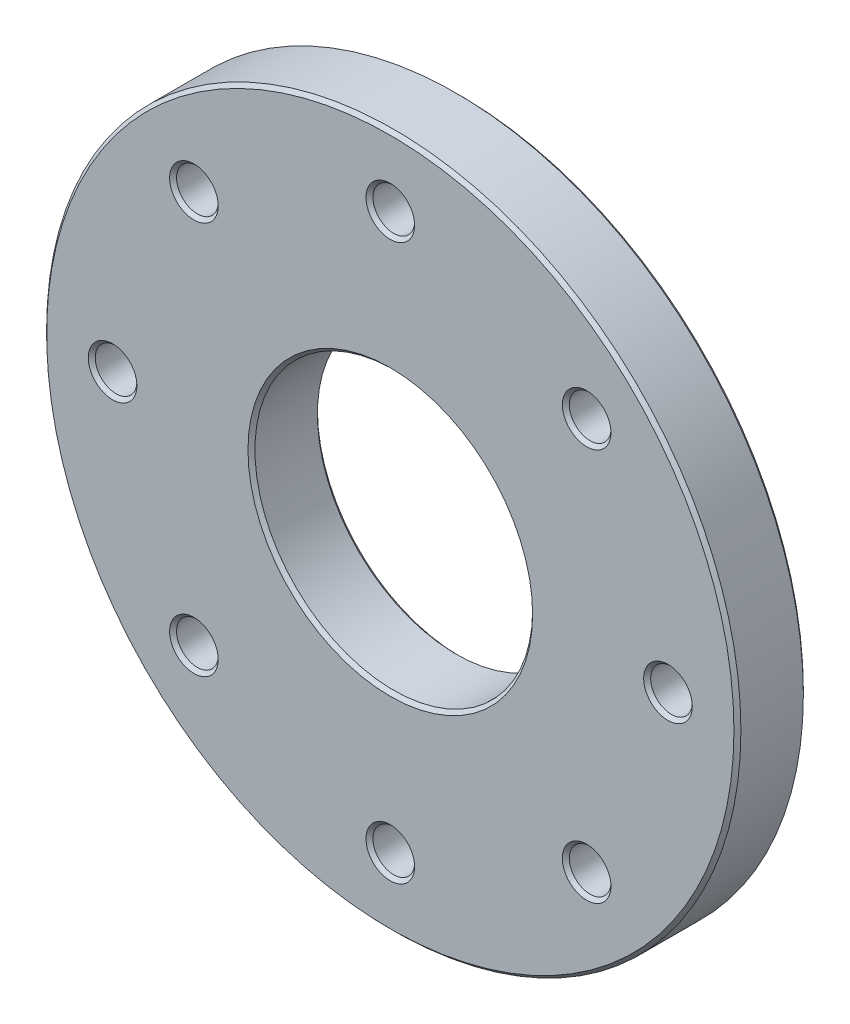
ISO-10303-21;
HEADER;
FILE_DESCRIPTION(('STEP AP214'),'2;1');
FILE_NAME('part.step','',(''),(''),'','','');
FILE_SCHEMA(('AUTOMOTIVE_DESIGN { 1 0 10303 214 1 1 1 1 }'));
ENDSEC;
DATA;
#1=APPLICATION_CONTEXT('core data for automotive mechanical design processes');
#2=APPLICATION_PROTOCOL_DEFINITION('international standard','automotive_design',2000,#1);
#3=PRODUCT_CONTEXT('',#1,'mechanical');
#4=PRODUCT('Part','Part','',(#3));
#5=PRODUCT_RELATED_PRODUCT_CATEGORY('part','',(#4));
#6=PRODUCT_DEFINITION_FORMATION('','',#4);
#7=PRODUCT_DEFINITION_CONTEXT('part definition',#1,'design');
#8=PRODUCT_DEFINITION('design','',#6,#7);
#9=PRODUCT_DEFINITION_SHAPE('','',#8);
#10=(LENGTH_UNIT() NAMED_UNIT(*) SI_UNIT(.MILLI.,.METRE.));
#11=(NAMED_UNIT(*) PLANE_ANGLE_UNIT() SI_UNIT($,.RADIAN.));
#12=(NAMED_UNIT(*) SI_UNIT($,.STERADIAN.) SOLID_ANGLE_UNIT());
#13=UNCERTAINTY_MEASURE_WITH_UNIT(LENGTH_MEASURE(1.E-05),#10,'distance_accuracy_value','');
#14=(GEOMETRIC_REPRESENTATION_CONTEXT(3) GLOBAL_UNCERTAINTY_ASSIGNED_CONTEXT((#13)) GLOBAL_UNIT_ASSIGNED_CONTEXT((#10,
#11,#12)) REPRESENTATION_CONTEXT('',''));
#15=CARTESIAN_POINT('',(0.,0.,0.));
#16=DIRECTION('',(0.,0.,1.));
#17=DIRECTION('',(1.,0.,0.));
#18=AXIS2_PLACEMENT_3D('',#15,#16,#17);
#19=CARTESIAN_POINT('',(-56.56854249492,56.568542494924,0.));
#20=DIRECTION('',(0.,0.,-1.));
#21=DIRECTION('',(1.,0.,0.));
#22=AXIS2_PLACEMENT_3D('',#19,#20,#21);
#23=CYLINDRICAL_SURFACE('',#22,6.);
#24=DIRECTION('',(0.,0.,1.));
#25=VECTOR('',#24,1.);
#26=CARTESIAN_POINT('',(-50.56854249492,56.568542494924,0.));
#27=LINE('',#26,#25);
#28=CARTESIAN_POINT('',(-50.56854249492,56.568542494924,1.));
#29=VERTEX_POINT('',#28);
#30=CARTESIAN_POINT('',(-50.56854249492,56.568542494924,19.));
#31=VERTEX_POINT('',#30);
#32=EDGE_CURVE('E10',#29,#31,#27,.T.);
#33=ORIENTED_EDGE('',*,*,#32,.F.);
#34=CARTESIAN_POINT('',(-56.56854249492,56.568542494924,1.));
#35=DIRECTION('',(0.,0.,1.));
#36=DIRECTION('',(1.,0.,0.));
#37=AXIS2_PLACEMENT_3D('',#34,#35,#36);
#38=CIRCLE('',#37,6.);
#39=EDGE_CURVE('E399',#29,#29,#38,.T.);
#40=ORIENTED_EDGE('',*,*,#39,.F.);
#41=ORIENTED_EDGE('',*,*,#32,.T.);
#42=CARTESIAN_POINT('',(-56.56854249492,56.568542494924,19.));
#43=DIRECTION('',(0.,0.,-1.));
#44=DIRECTION('',(1.,0.,0.));
#45=AXIS2_PLACEMENT_3D('',#42,#43,#44);
#46=CIRCLE('',#45,6.);
#47=EDGE_CURVE('E428',#31,#31,#46,.T.);
#48=ORIENTED_EDGE('',*,*,#47,.F.);
#49=EDGE_LOOP('',(#33,#40,#41,#48));
#50=FACE_BOUND('',#49,.T.);
#51=ADVANCED_FACE('F16',(#50),#23,.F.);
#52=CARTESIAN_POINT('',(0.,80.,0.));
#53=DIRECTION('',(0.,0.,-1.));
#54=DIRECTION('',(1.,0.,0.));
#55=AXIS2_PLACEMENT_3D('',#52,#53,#54);
#56=CYLINDRICAL_SURFACE('',#55,6.);
#57=DIRECTION('',(0.,0.,1.));
#58=VECTOR('',#57,1.);
#59=CARTESIAN_POINT('',(6.,80.,0.));
#60=LINE('',#59,#58);
#61=CARTESIAN_POINT('',(6.,80.,1.));
#62=VERTEX_POINT('',#61);
#63=CARTESIAN_POINT('',(6.,80.,19.));
#64=VERTEX_POINT('',#63);
#65=EDGE_CURVE('E24',#62,#64,#60,.T.);
#66=ORIENTED_EDGE('',*,*,#65,.F.);
#67=CARTESIAN_POINT('',(0.,80.,1.));
#68=DIRECTION('',(0.,0.,1.));
#69=DIRECTION('',(1.,0.,0.));
#70=AXIS2_PLACEMENT_3D('',#67,#68,#69);
#71=CIRCLE('',#70,6.);
#72=EDGE_CURVE('E385',#62,#62,#71,.T.);
#73=ORIENTED_EDGE('',*,*,#72,.F.);
#74=ORIENTED_EDGE('',*,*,#65,.T.);
#75=CARTESIAN_POINT('',(0.,80.,19.));
#76=DIRECTION('',(0.,0.,-1.));
#77=DIRECTION('',(1.,0.,0.));
#78=AXIS2_PLACEMENT_3D('',#75,#76,#77);
#79=CIRCLE('',#78,6.);
#80=EDGE_CURVE('E452',#64,#64,#79,.T.);
#81=ORIENTED_EDGE('',*,*,#80,.F.);
#82=EDGE_LOOP('',(#66,#73,#74,#81));
#83=FACE_BOUND('',#82,.T.);
#84=ADVANCED_FACE('F503',(#83),#56,.F.);
#85=CARTESIAN_POINT('',(-80.,0.,0.));
#86=DIRECTION('',(0.,0.,-1.));
#87=DIRECTION('',(1.,0.,0.));
#88=AXIS2_PLACEMENT_3D('',#85,#86,#87);
#89=CYLINDRICAL_SURFACE('',#88,6.);
#90=DIRECTION('',(0.,0.,1.));
#91=VECTOR('',#90,1.);
#92=CARTESIAN_POINT('',(-74.,0.,0.));
#93=LINE('',#92,#91);
#94=CARTESIAN_POINT('',(-74.,0.,1.));
#95=VERTEX_POINT('',#94);
#96=CARTESIAN_POINT('',(-74.,0.,19.));
#97=VERTEX_POINT('',#96);
#98=EDGE_CURVE('E389',#95,#97,#93,.T.);
#99=ORIENTED_EDGE('',*,*,#98,.F.);
#100=CARTESIAN_POINT('',(-80.,0.,1.));
#101=DIRECTION('',(0.,0.,1.));
#102=DIRECTION('',(1.,0.,0.));
#103=AXIS2_PLACEMENT_3D('',#100,#101,#102);
#104=CIRCLE('',#103,6.);
#105=EDGE_CURVE('E377',#95,#95,#104,.T.);
#106=ORIENTED_EDGE('',*,*,#105,.F.);
#107=ORIENTED_EDGE('',*,*,#98,.T.);
#108=CARTESIAN_POINT('',(-80.,0.,19.));
#109=DIRECTION('',(0.,0.,-1.));
#110=DIRECTION('',(1.,0.,0.));
#111=AXIS2_PLACEMENT_3D('',#108,#109,#110);
#112=CIRCLE('',#111,6.);
#113=EDGE_CURVE('E420',#97,#97,#112,.T.);
#114=ORIENTED_EDGE('',*,*,#113,.F.);
#115=EDGE_LOOP('',(#99,#106,#107,#114));
#116=FACE_BOUND('',#115,.T.);
#117=ADVANCED_FACE('F470',(#116),#89,.F.);
#118=CARTESIAN_POINT('',(0.,0.,0.));
#119=DIRECTION('',(0.,0.,-1.));
#120=DIRECTION('',(1.,0.,0.));
#121=AXIS2_PLACEMENT_3D('',#118,#119,#120);
#122=CYLINDRICAL_SURFACE('',#121,40.);
#123=DIRECTION('',(0.,0.,1.));
#124=VECTOR('',#123,1.);
#125=CARTESIAN_POINT('',(40.,0.,0.));
#126=LINE('',#125,#124);
#127=CARTESIAN_POINT('',(40.,0.,1.));
#128=VERTEX_POINT('',#127);
#129=CARTESIAN_POINT('',(40.,0.,19.));
#130=VERTEX_POINT('',#129);
#131=EDGE_CURVE('E386',#128,#130,#126,.T.);
#132=ORIENTED_EDGE('',*,*,#131,.F.);
#133=CARTESIAN_POINT('',(0.,0.,1.));
#134=DIRECTION('',(0.,0.,1.));
#135=DIRECTION('',(1.,0.,0.));
#136=AXIS2_PLACEMENT_3D('',#133,#134,#135);
#137=CIRCLE('',#136,40.);
#138=EDGE_CURVE('E313',#128,#128,#137,.T.);
#139=ORIENTED_EDGE('',*,*,#138,.F.);
#140=ORIENTED_EDGE('',*,*,#131,.T.);
#141=CARTESIAN_POINT('',(0.,0.,19.));
#142=DIRECTION('',(0.,0.,-1.));
#143=DIRECTION('',(1.,0.,0.));
#144=AXIS2_PLACEMENT_3D('',#141,#142,#143);
#145=CIRCLE('',#144,40.);
#146=EDGE_CURVE('E436',#130,#130,#145,.T.);
#147=ORIENTED_EDGE('',*,*,#146,.F.);
#148=EDGE_LOOP('',(#132,#139,#140,#147));
#149=FACE_BOUND('',#148,.T.);
#150=ADVANCED_FACE('F581',(#149),#122,.F.);
#151=CARTESIAN_POINT('',(56.568542494924,56.568542494924,0.));
#152=DIRECTION('',(0.,0.,-1.));
#153=DIRECTION('',(1.,0.,0.));
#154=AXIS2_PLACEMENT_3D('',#151,#152,#153);
#155=CYLINDRICAL_SURFACE('',#154,6.);
#156=DIRECTION('',(0.,0.,1.));
#157=VECTOR('',#156,1.);
#158=CARTESIAN_POINT('',(62.568542494924,56.568542494924,0.));
#159=LINE('',#158,#157);
#160=CARTESIAN_POINT('',(62.568542494924,56.568542494924,1.));
#161=VERTEX_POINT('',#160);
#162=CARTESIAN_POINT('',(62.568542494924,56.568542494924,19.));
#163=VERTEX_POINT('',#162);
#164=EDGE_CURVE('E36',#161,#163,#159,.T.);
#165=ORIENTED_EDGE('',*,*,#164,.F.);
#166=CARTESIAN_POINT('',(56.568542494924,56.568542494924,1.));
#167=DIRECTION('',(0.,0.,1.));
#168=DIRECTION('',(1.,0.,0.));
#169=AXIS2_PLACEMENT_3D('',#166,#167,#168);
#170=CIRCLE('',#169,6.);
#171=EDGE_CURVE('E240',#161,#161,#170,.T.);
#172=ORIENTED_EDGE('',*,*,#171,.F.);
#173=ORIENTED_EDGE('',*,*,#164,.T.);
#174=CARTESIAN_POINT('',(56.568542494924,56.568542494924,19.));
#175=DIRECTION('',(0.,0.,-1.));
#176=DIRECTION('',(1.,0.,0.));
#177=AXIS2_PLACEMENT_3D('',#174,#175,#176);
#178=CIRCLE('',#177,6.);
#179=EDGE_CURVE('E293',#163,#163,#178,.T.);
#180=ORIENTED_EDGE('',*,*,#179,.F.);
#181=EDGE_LOOP('',(#165,#172,#173,#180));
#182=FACE_BOUND('',#181,.T.);
#183=ADVANCED_FACE('F578',(#182),#155,.F.);
#184=CARTESIAN_POINT('',(80.,0.,0.));
#185=DIRECTION('',(0.,0.,-1.));
#186=DIRECTION('',(1.,0.,0.));
#187=AXIS2_PLACEMENT_3D('',#184,#185,#186);
#188=CYLINDRICAL_SURFACE('',#187,6.);
#189=DIRECTION('',(0.,0.,1.));
#190=VECTOR('',#189,1.);
#191=CARTESIAN_POINT('',(86.,0.,0.));
#192=LINE('',#191,#190);
#193=CARTESIAN_POINT('',(86.,0.,1.));
#194=VERTEX_POINT('',#193);
#195=CARTESIAN_POINT('',(86.,0.,19.));
#196=VERTEX_POINT('',#195);
#197=EDGE_CURVE('E346',#194,#196,#192,.T.);
#198=ORIENTED_EDGE('',*,*,#197,.F.);
#199=CARTESIAN_POINT('',(80.,0.,1.));
#200=DIRECTION('',(0.,0.,1.));
#201=DIRECTION('',(1.,0.,0.));
#202=AXIS2_PLACEMENT_3D('',#199,#200,#201);
#203=CIRCLE('',#202,6.);
#204=EDGE_CURVE('E241',#194,#194,#203,.T.);
#205=ORIENTED_EDGE('',*,*,#204,.F.);
#206=ORIENTED_EDGE('',*,*,#197,.T.);
#207=CARTESIAN_POINT('',(80.,0.,19.));
#208=DIRECTION('',(0.,0.,-1.));
#209=DIRECTION('',(1.,0.,0.));
#210=AXIS2_PLACEMENT_3D('',#207,#208,#209);
#211=CIRCLE('',#210,6.);
#212=EDGE_CURVE('E444',#196,#196,#211,.T.);
#213=ORIENTED_EDGE('',*,*,#212,.F.);
#214=EDGE_LOOP('',(#198,#205,#206,#213));
#215=FACE_BOUND('',#214,.T.);
#216=ADVANCED_FACE('F576',(#215),#188,.F.);
#217=CARTESIAN_POINT('',(-56.56854249492,-56.56854249492,0.));
#218=DIRECTION('',(0.,0.,-1.));
#219=DIRECTION('',(1.,0.,0.));
#220=AXIS2_PLACEMENT_3D('',#217,#218,#219);
#221=CYLINDRICAL_SURFACE('',#220,6.);
#222=DIRECTION('',(0.,0.,1.));
#223=VECTOR('',#222,1.);
#224=CARTESIAN_POINT('',(-50.56854249492,-56.56854249492,0.));
#225=LINE('',#224,#223);
#226=CARTESIAN_POINT('',(-50.56854249492,-56.56854249492,1.));
#227=VERTEX_POINT('',#226);
#228=CARTESIAN_POINT('',(-50.56854249492,-56.56854249492,19.));
#229=VERTEX_POINT('',#228);
#230=EDGE_CURVE('E308',#227,#229,#225,.T.);
#231=ORIENTED_EDGE('',*,*,#230,.F.);
#232=CARTESIAN_POINT('',(-56.56854249492,-56.56854249492,1.));
#233=DIRECTION('',(0.,0.,1.));
#234=DIRECTION('',(1.,0.,0.));
#235=AXIS2_PLACEMENT_3D('',#232,#233,#234);
#236=CIRCLE('',#235,6.);
#237=EDGE_CURVE('E356',#227,#227,#236,.T.);
#238=ORIENTED_EDGE('',*,*,#237,.F.);
#239=ORIENTED_EDGE('',*,*,#230,.T.);
#240=CARTESIAN_POINT('',(-56.56854249492,-56.56854249492,19.));
#241=DIRECTION('',(0.,0.,-1.));
#242=DIRECTION('',(1.,0.,0.));
#243=AXIS2_PLACEMENT_3D('',#240,#241,#242);
#244=CIRCLE('',#243,6.);
#245=EDGE_CURVE('E229',#229,#229,#244,.T.);
#246=ORIENTED_EDGE('',*,*,#245,.F.);
#247=EDGE_LOOP('',(#231,#238,#239,#246));
#248=FACE_BOUND('',#247,.T.);
#249=ADVANCED_FACE('F572',(#248),#221,.F.);
#250=CARTESIAN_POINT('',(0.,-80.,0.));
#251=DIRECTION('',(0.,0.,-1.));
#252=DIRECTION('',(1.,0.,0.));
#253=AXIS2_PLACEMENT_3D('',#250,#251,#252);
#254=CYLINDRICAL_SURFACE('',#253,6.);
#255=DIRECTION('',(0.,0.,1.));
#256=VECTOR('',#255,1.);
#257=CARTESIAN_POINT('',(6.,-80.,0.));
#258=LINE('',#257,#256);
#259=CARTESIAN_POINT('',(6.,-80.,1.));
#260=VERTEX_POINT('',#259);
#261=CARTESIAN_POINT('',(6.,-80.,19.));
#262=VERTEX_POINT('',#261);
#263=EDGE_CURVE('E263',#260,#262,#258,.T.);
#264=ORIENTED_EDGE('',*,*,#263,.F.);
#265=CARTESIAN_POINT('',(0.,-80.,1.));
#266=DIRECTION('',(0.,0.,1.));
#267=DIRECTION('',(1.,0.,0.));
#268=AXIS2_PLACEMENT_3D('',#265,#266,#267);
#269=CIRCLE('',#268,6.);
#270=EDGE_CURVE('E345',#260,#260,#269,.T.);
#271=ORIENTED_EDGE('',*,*,#270,.F.);
#272=ORIENTED_EDGE('',*,*,#263,.T.);
#273=CARTESIAN_POINT('',(0.,-80.,19.));
#274=DIRECTION('',(0.,0.,-1.));
#275=DIRECTION('',(1.,0.,0.));
#276=AXIS2_PLACEMENT_3D('',#273,#274,#275);
#277=CIRCLE('',#276,6.);
#278=EDGE_CURVE('E228',#262,#262,#277,.T.);
#279=ORIENTED_EDGE('',*,*,#278,.F.);
#280=EDGE_LOOP('',(#264,#271,#272,#279));
#281=FACE_BOUND('',#280,.T.);
#282=ADVANCED_FACE('F569',(#281),#254,.F.);
#283=CARTESIAN_POINT('',(56.568542494924,-56.56854249492,0.));
#284=DIRECTION('',(0.,0.,-1.));
#285=DIRECTION('',(1.,0.,0.));
#286=AXIS2_PLACEMENT_3D('',#283,#284,#285);
#287=CYLINDRICAL_SURFACE('',#286,6.);
#288=DIRECTION('',(0.,0.,1.));
#289=VECTOR('',#288,1.);
#290=CARTESIAN_POINT('',(62.568542494924,-56.56854249492,0.));
#291=LINE('',#290,#289);
#292=CARTESIAN_POINT('',(62.568542494924,-56.56854249492,1.));
#293=VERTEX_POINT('',#292);
#294=CARTESIAN_POINT('',(62.568542494924,-56.56854249492,19.));
#295=VERTEX_POINT('',#294);
#296=EDGE_CURVE('E260',#293,#295,#291,.T.);
#297=ORIENTED_EDGE('',*,*,#296,.F.);
#298=CARTESIAN_POINT('',(56.568542494924,-56.56854249492,1.));
#299=DIRECTION('',(0.,0.,1.));
#300=DIRECTION('',(1.,0.,0.));
#301=AXIS2_PLACEMENT_3D('',#298,#299,#300);
#302=CIRCLE('',#301,6.);
#303=EDGE_CURVE('E337',#293,#293,#302,.T.);
#304=ORIENTED_EDGE('',*,*,#303,.F.);
#305=ORIENTED_EDGE('',*,*,#296,.T.);
#306=CARTESIAN_POINT('',(56.568542494924,-56.56854249492,19.));
#307=DIRECTION('',(0.,0.,-1.));
#308=DIRECTION('',(1.,0.,0.));
#309=AXIS2_PLACEMENT_3D('',#306,#307,#308);
#310=CIRCLE('',#309,6.);
#311=EDGE_CURVE('E253',#295,#295,#310,.T.);
#312=ORIENTED_EDGE('',*,*,#311,.F.);
#313=EDGE_LOOP('',(#297,#304,#305,#312));
#314=FACE_BOUND('',#313,.T.);
#315=ADVANCED_FACE('F533',(#314),#287,.F.);
#316=CARTESIAN_POINT('',(56.568542494924,56.568542494924,19.));
#317=DIRECTION('',(0.,0.,1.));
#318=DIRECTION('',(1.,0.,0.));
#319=AXIS2_PLACEMENT_3D('',#316,#317,#318);
#320=CONICAL_SURFACE('',#319,6.,0.785398163397);
#321=ORIENTED_EDGE('',*,*,#179,.T.);
#322=DIRECTION('',(-0.707106781186548,0.,-0.707106781186548));
#323=VECTOR('',#322,1.);
#324=CARTESIAN_POINT('',(62.568542494924,56.568542494924,19.));
#325=LINE('',#324,#323);
#326=CARTESIAN_POINT('',(63.568542494924,56.568542494924,20.));
#327=VERTEX_POINT('',#326);
#328=EDGE_CURVE('E264',#327,#163,#325,.T.);
#329=ORIENTED_EDGE('',*,*,#328,.F.);
#330=CARTESIAN_POINT('',(56.568542494924,56.568542494924,20.));
#331=DIRECTION('',(0.,0.,-1.));
#332=DIRECTION('',(1.,0.,0.));
#333=AXIS2_PLACEMENT_3D('',#330,#331,#332);
#334=CIRCLE('',#333,7.);
#335=EDGE_CURVE('E333',#327,#327,#334,.T.);
#336=ORIENTED_EDGE('',*,*,#335,.F.);
#337=ORIENTED_EDGE('',*,*,#328,.T.);
#338=EDGE_LOOP('',(#321,#329,#336,#337));
#339=FACE_BOUND('',#338,.T.);
#340=ADVANCED_FACE('F562',(#339),#320,.F.);
#341=CARTESIAN_POINT('',(0.,80.,19.));
#342=DIRECTION('',(0.,0.,1.));
#343=DIRECTION('',(1.,0.,0.));
#344=AXIS2_PLACEMENT_3D('',#341,#342,#343);
#345=CONICAL_SURFACE('',#344,6.,0.785398163397);
#346=ORIENTED_EDGE('',*,*,#80,.T.);
#347=DIRECTION('',(-0.707106781186548,0.,-0.707106781186548));
#348=VECTOR('',#347,1.);
#349=CARTESIAN_POINT('',(6.,80.,19.));
#350=LINE('',#349,#348);
#351=CARTESIAN_POINT('',(7.,80.,20.));
#352=VERTEX_POINT('',#351);
#353=EDGE_CURVE('E458',#352,#64,#350,.T.);
#354=ORIENTED_EDGE('',*,*,#353,.F.);
#355=CARTESIAN_POINT('',(0.,80.,20.));
#356=DIRECTION('',(0.,0.,-1.));
#357=DIRECTION('',(1.,0.,0.));
#358=AXIS2_PLACEMENT_3D('',#355,#356,#357);
#359=CIRCLE('',#358,7.);
#360=EDGE_CURVE('E329',#352,#352,#359,.T.);
#361=ORIENTED_EDGE('',*,*,#360,.F.);
#362=ORIENTED_EDGE('',*,*,#353,.T.);
#363=EDGE_LOOP('',(#346,#354,#361,#362));
#364=FACE_BOUND('',#363,.T.);
#365=ADVANCED_FACE('F559',(#364),#345,.F.);
#366=CARTESIAN_POINT('',(80.,0.,19.));
#367=DIRECTION('',(0.,0.,1.));
#368=DIRECTION('',(1.,0.,0.));
#369=AXIS2_PLACEMENT_3D('',#366,#367,#368);
#370=CONICAL_SURFACE('',#369,6.,0.785398163397);
#371=ORIENTED_EDGE('',*,*,#212,.T.);
#372=DIRECTION('',(-0.707106781186548,0.,-0.707106781186548));
#373=VECTOR('',#372,1.);
#374=CARTESIAN_POINT('',(86.,0.,19.));
#375=LINE('',#374,#373);
#376=CARTESIAN_POINT('',(87.,0.,20.));
#377=VERTEX_POINT('',#376);
#378=EDGE_CURVE('E448',#377,#196,#375,.T.);
#379=ORIENTED_EDGE('',*,*,#378,.F.);
#380=CARTESIAN_POINT('',(80.,0.,20.));
#381=DIRECTION('',(0.,0.,-1.));
#382=DIRECTION('',(1.,0.,0.));
#383=AXIS2_PLACEMENT_3D('',#380,#381,#382);
#384=CIRCLE('',#383,7.);
#385=EDGE_CURVE('E325',#377,#377,#384,.T.);
#386=ORIENTED_EDGE('',*,*,#385,.F.);
#387=ORIENTED_EDGE('',*,*,#378,.T.);
#388=EDGE_LOOP('',(#371,#379,#386,#387));
#389=FACE_BOUND('',#388,.T.);
#390=ADVANCED_FACE('F557',(#389),#370,.F.);
#391=CARTESIAN_POINT('',(0.,0.,19.));
#392=DIRECTION('',(0.,0.,1.));
#393=DIRECTION('',(1.,0.,0.));
#394=AXIS2_PLACEMENT_3D('',#391,#392,#393);
#395=CONICAL_SURFACE('',#394,40.,0.785398163397);
#396=ORIENTED_EDGE('',*,*,#146,.T.);
#397=DIRECTION('',(-0.707106781186548,0.,-0.707106781186548));
#398=VECTOR('',#397,1.);
#399=CARTESIAN_POINT('',(40.,0.,19.));
#400=LINE('',#399,#398);
#401=CARTESIAN_POINT('',(41.,0.,20.));
#402=VERTEX_POINT('',#401);
#403=EDGE_CURVE('E440',#402,#130,#400,.T.);
#404=ORIENTED_EDGE('',*,*,#403,.F.);
#405=CARTESIAN_POINT('',(0.,0.,20.));
#406=DIRECTION('',(0.,0.,-1.));
#407=DIRECTION('',(1.,0.,0.));
#408=AXIS2_PLACEMENT_3D('',#405,#406,#407);
#409=CIRCLE('',#408,41.);
#410=EDGE_CURVE('E321',#402,#402,#409,.T.);
#411=ORIENTED_EDGE('',*,*,#410,.F.);
#412=ORIENTED_EDGE('',*,*,#403,.T.);
#413=EDGE_LOOP('',(#396,#404,#411,#412));
#414=FACE_BOUND('',#413,.T.);
#415=ADVANCED_FACE('F553',(#414),#395,.F.);
#416=CARTESIAN_POINT('',(-56.56854249492,56.568542494924,19.));
#417=DIRECTION('',(0.,0.,1.));
#418=DIRECTION('',(1.,0.,0.));
#419=AXIS2_PLACEMENT_3D('',#416,#417,#418);
#420=CONICAL_SURFACE('',#419,6.,0.785398163397);
#421=ORIENTED_EDGE('',*,*,#47,.T.);
#422=DIRECTION('',(-0.707106781186548,0.,-0.707106781186548));
#423=VECTOR('',#422,1.);
#424=CARTESIAN_POINT('',(-50.56854249492,56.568542494924,19.));
#425=LINE('',#424,#423);
#426=CARTESIAN_POINT('',(-49.56854249492,56.568542494924,20.));
#427=VERTEX_POINT('',#426);
#428=EDGE_CURVE('E432',#427,#31,#425,.T.);
#429=ORIENTED_EDGE('',*,*,#428,.F.);
#430=CARTESIAN_POINT('',(-56.56854249492,56.568542494924,20.));
#431=DIRECTION('',(0.,0.,-1.));
#432=DIRECTION('',(1.,0.,0.));
#433=AXIS2_PLACEMENT_3D('',#430,#431,#432);
#434=CIRCLE('',#433,7.);
#435=EDGE_CURVE('E317',#427,#427,#434,.T.);
#436=ORIENTED_EDGE('',*,*,#435,.F.);
#437=ORIENTED_EDGE('',*,*,#428,.T.);
#438=EDGE_LOOP('',(#421,#429,#436,#437));
#439=FACE_BOUND('',#438,.T.);
#440=ADVANCED_FACE('F547',(#439),#420,.F.);
#441=CARTESIAN_POINT('',(-80.,0.,19.));
#442=DIRECTION('',(0.,0.,1.));
#443=DIRECTION('',(1.,0.,0.));
#444=AXIS2_PLACEMENT_3D('',#441,#442,#443);
#445=CONICAL_SURFACE('',#444,6.,0.785398163397);
#446=ORIENTED_EDGE('',*,*,#113,.T.);
#447=DIRECTION('',(-0.707106781186548,0.,-0.707106781186548));
#448=VECTOR('',#447,1.);
#449=CARTESIAN_POINT('',(-74.,0.,19.));
#450=LINE('',#449,#448);
#451=CARTESIAN_POINT('',(-73.,0.,20.));
#452=VERTEX_POINT('',#451);
#453=EDGE_CURVE('E424',#452,#97,#450,.T.);
#454=ORIENTED_EDGE('',*,*,#453,.F.);
#455=CARTESIAN_POINT('',(-80.,0.,20.));
#456=DIRECTION('',(0.,0.,-1.));
#457=DIRECTION('',(1.,0.,0.));
#458=AXIS2_PLACEMENT_3D('',#455,#456,#457);
#459=CIRCLE('',#458,7.);
#460=EDGE_CURVE('E305',#452,#452,#459,.T.);
#461=ORIENTED_EDGE('',*,*,#460,.F.);
#462=ORIENTED_EDGE('',*,*,#453,.T.);
#463=EDGE_LOOP('',(#446,#454,#461,#462));
#464=FACE_BOUND('',#463,.T.);
#465=ADVANCED_FACE('F473',(#464),#445,.F.);
#466=CARTESIAN_POINT('',(56.568542494924,-56.56854249492,19.));
#467=DIRECTION('',(0.,0.,1.));
#468=DIRECTION('',(1.,0.,0.));
#469=AXIS2_PLACEMENT_3D('',#466,#467,#468);
#470=CONICAL_SURFACE('',#469,6.,0.785398163397);
#471=ORIENTED_EDGE('',*,*,#311,.T.);
#472=DIRECTION('',(-0.707106781186548,0.,-0.707106781186548));
#473=VECTOR('',#472,1.);
#474=CARTESIAN_POINT('',(62.568542494924,-56.56854249492,19.));
#475=LINE('',#474,#473);
#476=CARTESIAN_POINT('',(63.568542494924,-56.56854249492,20.));
#477=VERTEX_POINT('',#476);
#478=EDGE_CURVE('E416',#477,#295,#475,.T.);
#479=ORIENTED_EDGE('',*,*,#478,.F.);
#480=CARTESIAN_POINT('',(56.568542494924,-56.56854249492,20.));
#481=DIRECTION('',(0.,0.,-1.));
#482=DIRECTION('',(1.,0.,0.));
#483=AXIS2_PLACEMENT_3D('',#480,#481,#482);
#484=CIRCLE('',#483,7.);
#485=EDGE_CURVE('E301',#477,#477,#484,.T.);
#486=ORIENTED_EDGE('',*,*,#485,.F.);
#487=ORIENTED_EDGE('',*,*,#478,.T.);
#488=EDGE_LOOP('',(#471,#479,#486,#487));
#489=FACE_BOUND('',#488,.T.);
#490=ADVANCED_FACE('F536',(#489),#470,.F.);
#491=CARTESIAN_POINT('',(0.,-80.,19.));
#492=DIRECTION('',(0.,0.,1.));
#493=DIRECTION('',(1.,0.,0.));
#494=AXIS2_PLACEMENT_3D('',#491,#492,#493);
#495=CONICAL_SURFACE('',#494,6.,0.785398163397);
#496=ORIENTED_EDGE('',*,*,#278,.T.);
#497=DIRECTION('',(-0.707106781186548,0.,-0.707106781186548));
#498=VECTOR('',#497,1.);
#499=CARTESIAN_POINT('',(6.,-80.,19.));
#500=LINE('',#499,#498);
#501=CARTESIAN_POINT('',(7.,-80.,20.));
#502=VERTEX_POINT('',#501);
#503=EDGE_CURVE('E249',#502,#262,#500,.T.);
#504=ORIENTED_EDGE('',*,*,#503,.F.);
#505=CARTESIAN_POINT('',(0.,-80.,20.));
#506=DIRECTION('',(0.,0.,-1.));
#507=DIRECTION('',(1.,0.,0.));
#508=AXIS2_PLACEMENT_3D('',#505,#506,#507);
#509=CIRCLE('',#508,7.);
#510=EDGE_CURVE('E297',#502,#502,#509,.T.);
#511=ORIENTED_EDGE('',*,*,#510,.F.);
#512=ORIENTED_EDGE('',*,*,#503,.T.);
#513=EDGE_LOOP('',(#496,#504,#511,#512));
#514=FACE_BOUND('',#513,.T.);
#515=ADVANCED_FACE('F538',(#514),#495,.F.);
#516=CARTESIAN_POINT('',(-56.56854249492,-56.56854249492,19.));
#517=DIRECTION('',(0.,0.,1.));
#518=DIRECTION('',(1.,0.,0.));
#519=AXIS2_PLACEMENT_3D('',#516,#517,#518);
#520=CONICAL_SURFACE('',#519,6.,0.785398163397);
#521=ORIENTED_EDGE('',*,*,#245,.T.);
#522=DIRECTION('',(-0.707106781186548,0.,-0.707106781186548));
#523=VECTOR('',#522,1.);
#524=CARTESIAN_POINT('',(-50.56854249492,-56.56854249492,19.));
#525=LINE('',#524,#523);
#526=CARTESIAN_POINT('',(-49.56854249492,-56.56854249492,20.));
#527=VERTEX_POINT('',#526);
#528=EDGE_CURVE('E224',#527,#229,#525,.T.);
#529=ORIENTED_EDGE('',*,*,#528,.F.);
#530=CARTESIAN_POINT('',(-56.56854249492,-56.56854249492,20.));
#531=DIRECTION('',(0.,0.,-1.));
#532=DIRECTION('',(1.,0.,0.));
#533=AXIS2_PLACEMENT_3D('',#530,#531,#532);
#534=CIRCLE('',#533,7.);
#535=EDGE_CURVE('E258',#527,#527,#534,.T.);
#536=ORIENTED_EDGE('',*,*,#535,.F.);
#537=ORIENTED_EDGE('',*,*,#528,.T.);
#538=EDGE_LOOP('',(#521,#529,#536,#537));
#539=FACE_BOUND('',#538,.T.);
#540=ADVANCED_FACE('F544',(#539),#520,.F.);
#541=CARTESIAN_POINT('',(-56.56854249492,56.568542494924,1.));
#542=DIRECTION('',(0.,0.,-1.));
#543=DIRECTION('',(1.,0.,0.));
#544=AXIS2_PLACEMENT_3D('',#541,#542,#543);
#545=CONICAL_SURFACE('',#544,6.,0.785398163397);
#546=ORIENTED_EDGE('',*,*,#39,.T.);
#547=DIRECTION('',(-0.707106781186548,0.,0.707106781186548));
#548=VECTOR('',#547,1.);
#549=CARTESIAN_POINT('',(-50.56854249492,56.568542494924,1.));
#550=LINE('',#549,#548);
#551=CARTESIAN_POINT('',(-49.56854249492,56.568542494924,0.));
#552=VERTEX_POINT('',#551);
#553=EDGE_CURVE('E403',#552,#29,#550,.T.);
#554=ORIENTED_EDGE('',*,*,#553,.F.);
#555=CARTESIAN_POINT('',(-56.56854249492,56.568542494924,0.));
#556=DIRECTION('',(0.,0.,1.));
#557=DIRECTION('',(1.,0.,0.));
#558=AXIS2_PLACEMENT_3D('',#555,#556,#557);
#559=CIRCLE('',#558,7.);
#560=EDGE_CURVE('E254',#552,#552,#559,.T.);
#561=ORIENTED_EDGE('',*,*,#560,.F.);
#562=ORIENTED_EDGE('',*,*,#553,.T.);
#563=EDGE_LOOP('',(#546,#554,#561,#562));
#564=FACE_BOUND('',#563,.T.);
#565=ADVANCED_FACE('F512',(#564),#545,.F.);
#566=CARTESIAN_POINT('',(0.,80.,1.));
#567=DIRECTION('',(0.,0.,-1.));
#568=DIRECTION('',(1.,0.,0.));
#569=AXIS2_PLACEMENT_3D('',#566,#567,#568);
#570=CONICAL_SURFACE('',#569,6.,0.785398163397);
#571=ORIENTED_EDGE('',*,*,#72,.T.);
#572=DIRECTION('',(-0.707106781186548,0.,0.707106781186548));
#573=VECTOR('',#572,1.);
#574=CARTESIAN_POINT('',(6.,80.,1.));
#575=LINE('',#574,#573);
#576=CARTESIAN_POINT('',(7.,80.,0.));
#577=VERTEX_POINT('',#576);
#578=EDGE_CURVE('E393',#577,#62,#575,.T.);
#579=ORIENTED_EDGE('',*,*,#578,.F.);
#580=CARTESIAN_POINT('',(0.,80.,0.));
#581=DIRECTION('',(0.,0.,1.));
#582=DIRECTION('',(1.,0.,0.));
#583=AXIS2_PLACEMENT_3D('',#580,#581,#582);
#584=CIRCLE('',#583,7.);
#585=EDGE_CURVE('E259',#577,#577,#584,.T.);
#586=ORIENTED_EDGE('',*,*,#585,.F.);
#587=ORIENTED_EDGE('',*,*,#578,.T.);
#588=EDGE_LOOP('',(#571,#579,#586,#587));
#589=FACE_BOUND('',#588,.T.);
#590=ADVANCED_FACE('F690',(#589),#570,.F.);
#591=CARTESIAN_POINT('',(-80.,0.,1.));
#592=DIRECTION('',(0.,0.,-1.));
#593=DIRECTION('',(1.,0.,0.));
#594=AXIS2_PLACEMENT_3D('',#591,#592,#593);
#595=CONICAL_SURFACE('',#594,6.,0.785398163397);
#596=ORIENTED_EDGE('',*,*,#105,.T.);
#597=DIRECTION('',(-0.707106781186548,0.,0.707106781186548));
#598=VECTOR('',#597,1.);
#599=CARTESIAN_POINT('',(-74.,0.,1.));
#600=LINE('',#599,#598);
#601=CARTESIAN_POINT('',(-73.,0.,0.));
#602=VERTEX_POINT('',#601);
#603=EDGE_CURVE('E381',#602,#95,#600,.T.);
#604=ORIENTED_EDGE('',*,*,#603,.F.);
#605=CARTESIAN_POINT('',(-80.,0.,0.));
#606=DIRECTION('',(0.,0.,1.));
#607=DIRECTION('',(1.,0.,0.));
#608=AXIS2_PLACEMENT_3D('',#605,#606,#607);
#609=CIRCLE('',#608,7.);
#610=EDGE_CURVE('E281',#602,#602,#609,.T.);
#611=ORIENTED_EDGE('',*,*,#610,.F.);
#612=ORIENTED_EDGE('',*,*,#603,.T.);
#613=EDGE_LOOP('',(#596,#604,#611,#612));
#614=FACE_BOUND('',#613,.T.);
#615=ADVANCED_FACE('F700',(#614),#595,.F.);
#616=CARTESIAN_POINT('',(0.,0.,1.));
#617=DIRECTION('',(0.,0.,-1.));
#618=DIRECTION('',(1.,0.,0.));
#619=AXIS2_PLACEMENT_3D('',#616,#617,#618);
#620=CONICAL_SURFACE('',#619,40.,0.785398163397);
#621=ORIENTED_EDGE('',*,*,#138,.T.);
#622=DIRECTION('',(-0.707106781186548,0.,0.707106781186548));
#623=VECTOR('',#622,1.);
#624=CARTESIAN_POINT('',(40.,0.,1.));
#625=LINE('',#624,#623);
#626=CARTESIAN_POINT('',(41.,0.,0.));
#627=VERTEX_POINT('',#626);
#628=EDGE_CURVE('E373',#627,#128,#625,.T.);
#629=ORIENTED_EDGE('',*,*,#628,.F.);
#630=CARTESIAN_POINT('',(0.,0.,0.));
#631=DIRECTION('',(0.,0.,1.));
#632=DIRECTION('',(1.,0.,0.));
#633=AXIS2_PLACEMENT_3D('',#630,#631,#632);
#634=CIRCLE('',#633,41.);
#635=EDGE_CURVE('E277',#627,#627,#634,.T.);
#636=ORIENTED_EDGE('',*,*,#635,.F.);
#637=ORIENTED_EDGE('',*,*,#628,.T.);
#638=EDGE_LOOP('',(#621,#629,#636,#637));
#639=FACE_BOUND('',#638,.T.);
#640=ADVANCED_FACE('F710',(#639),#620,.F.);
#641=CARTESIAN_POINT('',(56.568542494924,56.568542494924,1.));
#642=DIRECTION('',(0.,0.,-1.));
#643=DIRECTION('',(1.,0.,0.));
#644=AXIS2_PLACEMENT_3D('',#641,#642,#643);
#645=CONICAL_SURFACE('',#644,6.,0.785398163397);
#646=ORIENTED_EDGE('',*,*,#171,.T.);
#647=DIRECTION('',(-0.707106781186548,0.,0.707106781186548));
#648=VECTOR('',#647,1.);
#649=CARTESIAN_POINT('',(62.568542494924,56.568542494924,1.));
#650=LINE('',#649,#648);
#651=CARTESIAN_POINT('',(63.568542494924,56.568542494924,0.));
#652=VERTEX_POINT('',#651);
#653=EDGE_CURVE('E309',#652,#161,#650,.T.);
#654=ORIENTED_EDGE('',*,*,#653,.F.);
#655=CARTESIAN_POINT('',(56.568542494924,56.568542494924,0.));
#656=DIRECTION('',(0.,0.,1.));
#657=DIRECTION('',(1.,0.,0.));
#658=AXIS2_PLACEMENT_3D('',#655,#656,#657);
#659=CIRCLE('',#658,7.);
#660=EDGE_CURVE('E276',#652,#652,#659,.T.);
#661=ORIENTED_EDGE('',*,*,#660,.F.);
#662=ORIENTED_EDGE('',*,*,#653,.T.);
#663=EDGE_LOOP('',(#646,#654,#661,#662));
#664=FACE_BOUND('',#663,.T.);
#665=ADVANCED_FACE('F720',(#664),#645,.F.);
#666=CARTESIAN_POINT('',(80.,0.,1.));
#667=DIRECTION('',(0.,0.,-1.));
#668=DIRECTION('',(1.,0.,0.));
#669=AXIS2_PLACEMENT_3D('',#666,#667,#668);
#670=CONICAL_SURFACE('',#669,6.,0.785398163397);
#671=ORIENTED_EDGE('',*,*,#204,.T.);
#672=DIRECTION('',(-0.707106781186548,0.,0.707106781186548));
#673=VECTOR('',#672,1.);
#674=CARTESIAN_POINT('',(86.,0.,1.));
#675=LINE('',#674,#673);
#676=CARTESIAN_POINT('',(87.,0.,0.));
#677=VERTEX_POINT('',#676);
#678=EDGE_CURVE('E236',#677,#194,#675,.T.);
#679=ORIENTED_EDGE('',*,*,#678,.F.);
#680=CARTESIAN_POINT('',(80.,0.,0.));
#681=DIRECTION('',(0.,0.,1.));
#682=DIRECTION('',(1.,0.,0.));
#683=AXIS2_PLACEMENT_3D('',#680,#681,#682);
#684=CIRCLE('',#683,7.);
#685=EDGE_CURVE('E272',#677,#677,#684,.T.);
#686=ORIENTED_EDGE('',*,*,#685,.F.);
#687=ORIENTED_EDGE('',*,*,#678,.T.);
#688=EDGE_LOOP('',(#671,#679,#686,#687));
#689=FACE_BOUND('',#688,.T.);
#690=ADVANCED_FACE('F730',(#689),#670,.F.);
#691=CARTESIAN_POINT('',(-56.56854249492,-56.56854249492,1.));
#692=DIRECTION('',(0.,0.,-1.));
#693=DIRECTION('',(1.,0.,0.));
#694=AXIS2_PLACEMENT_3D('',#691,#692,#693);
#695=CONICAL_SURFACE('',#694,6.,0.785398163397);
#696=ORIENTED_EDGE('',*,*,#237,.T.);
#697=DIRECTION('',(-0.707106781186548,0.,0.707106781186548));
#698=VECTOR('',#697,1.);
#699=CARTESIAN_POINT('',(-50.56854249492,-56.56854249492,1.));
#700=LINE('',#699,#698);
#701=CARTESIAN_POINT('',(-49.56854249492,-56.56854249492,0.));
#702=VERTEX_POINT('',#701);
#703=EDGE_CURVE('E360',#702,#227,#700,.T.);
#704=ORIENTED_EDGE('',*,*,#703,.F.);
#705=CARTESIAN_POINT('',(-56.56854249492,-56.56854249492,0.));
#706=DIRECTION('',(0.,0.,1.));
#707=DIRECTION('',(1.,0.,0.));
#708=AXIS2_PLACEMENT_3D('',#705,#706,#707);
#709=CIRCLE('',#708,7.);
#710=EDGE_CURVE('E268',#702,#702,#709,.T.);
#711=ORIENTED_EDGE('',*,*,#710,.F.);
#712=ORIENTED_EDGE('',*,*,#703,.T.);
#713=EDGE_LOOP('',(#696,#704,#711,#712));
#714=FACE_BOUND('',#713,.T.);
#715=ADVANCED_FACE('F740',(#714),#695,.F.);
#716=CARTESIAN_POINT('',(0.,-80.,1.));
#717=DIRECTION('',(0.,0.,-1.));
#718=DIRECTION('',(1.,0.,0.));
#719=AXIS2_PLACEMENT_3D('',#716,#717,#718);
#720=CONICAL_SURFACE('',#719,6.,0.785398163397);
#721=ORIENTED_EDGE('',*,*,#270,.T.);
#722=DIRECTION('',(-0.707106781186548,0.,0.707106781186548));
#723=VECTOR('',#722,1.);
#724=CARTESIAN_POINT('',(6.,-80.,1.));
#725=LINE('',#724,#723);
#726=CARTESIAN_POINT('',(7.,-80.,0.));
#727=VERTEX_POINT('',#726);
#728=EDGE_CURVE('E352',#727,#260,#725,.T.);
#729=ORIENTED_EDGE('',*,*,#728,.F.);
#730=CARTESIAN_POINT('',(0.,-80.,0.));
#731=DIRECTION('',(0.,0.,1.));
#732=DIRECTION('',(1.,0.,0.));
#733=AXIS2_PLACEMENT_3D('',#730,#731,#732);
#734=CIRCLE('',#733,7.);
#735=EDGE_CURVE('E246',#727,#727,#734,.T.);
#736=ORIENTED_EDGE('',*,*,#735,.F.);
#737=ORIENTED_EDGE('',*,*,#728,.T.);
#738=EDGE_LOOP('',(#721,#729,#736,#737));
#739=FACE_BOUND('',#738,.T.);
#740=ADVANCED_FACE('F750',(#739),#720,.F.);
#741=CARTESIAN_POINT('',(56.568542494924,-56.56854249492,1.));
#742=DIRECTION('',(0.,0.,-1.));
#743=DIRECTION('',(1.,0.,0.));
#744=AXIS2_PLACEMENT_3D('',#741,#742,#743);
#745=CONICAL_SURFACE('',#744,6.,0.785398163397);
#746=ORIENTED_EDGE('',*,*,#303,.T.);
#747=DIRECTION('',(-0.707106781186548,0.,0.707106781186548));
#748=VECTOR('',#747,1.);
#749=CARTESIAN_POINT('',(62.568542494924,-56.56854249492,1.));
#750=LINE('',#749,#748);
#751=CARTESIAN_POINT('',(63.568542494924,-56.56854249492,0.));
#752=VERTEX_POINT('',#751);
#753=EDGE_CURVE('E341',#752,#293,#750,.T.);
#754=ORIENTED_EDGE('',*,*,#753,.F.);
#755=CARTESIAN_POINT('',(56.568542494924,-56.56854249492,0.));
#756=DIRECTION('',(0.,0.,1.));
#757=DIRECTION('',(1.,0.,0.));
#758=AXIS2_PLACEMENT_3D('',#755,#756,#757);
#759=CIRCLE('',#758,7.);
#760=EDGE_CURVE('E242',#752,#752,#759,.T.);
#761=ORIENTED_EDGE('',*,*,#760,.F.);
#762=ORIENTED_EDGE('',*,*,#753,.T.);
#763=EDGE_LOOP('',(#746,#754,#761,#762));
#764=FACE_BOUND('',#763,.T.);
#765=ADVANCED_FACE('F479',(#764),#745,.F.);
#766=CARTESIAN_POINT('',(0.,0.,20.));
#767=DIRECTION('',(0.,0.,1.));
#768=DIRECTION('',(1.,0.,0.));
#769=AXIS2_PLACEMENT_3D('',#766,#767,#768);
#770=PLANE('',#769);
#771=ORIENTED_EDGE('',*,*,#335,.T.);
#772=EDGE_LOOP('',(#771));
#773=FACE_BOUND('',#772,.T.);
#774=ORIENTED_EDGE('',*,*,#360,.T.);
#775=EDGE_LOOP('',(#774));
#776=FACE_BOUND('',#775,.T.);
#777=ORIENTED_EDGE('',*,*,#385,.T.);
#778=EDGE_LOOP('',(#777));
#779=FACE_BOUND('',#778,.T.);
#780=ORIENTED_EDGE('',*,*,#410,.T.);
#781=EDGE_LOOP('',(#780));
#782=FACE_BOUND('',#781,.T.);
#783=ORIENTED_EDGE('',*,*,#435,.T.);
#784=EDGE_LOOP('',(#783));
#785=FACE_BOUND('',#784,.T.);
#786=ORIENTED_EDGE('',*,*,#460,.T.);
#787=EDGE_LOOP('',(#786));
#788=FACE_BOUND('',#787,.T.);
#789=ORIENTED_EDGE('',*,*,#485,.T.);
#790=EDGE_LOOP('',(#789));
#791=FACE_BOUND('',#790,.T.);
#792=ORIENTED_EDGE('',*,*,#510,.T.);
#793=EDGE_LOOP('',(#792));
#794=FACE_BOUND('',#793,.T.);
#795=ORIENTED_EDGE('',*,*,#535,.T.);
#796=EDGE_LOOP('',(#795));
#797=FACE_BOUND('',#796,.T.);
#798=CARTESIAN_POINT('',(0.,0.,20.));
#799=DIRECTION('',(0.,0.,1.));
#800=DIRECTION('',(1.,0.,0.));
#801=AXIS2_PLACEMENT_3D('',#798,#799,#800);
#802=CIRCLE('',#801,99.);
#803=CARTESIAN_POINT('',(99.,0.,20.));
#804=VERTEX_POINT('',#803);
#805=EDGE_CURVE('E235',#804,#804,#802,.T.);
#806=ORIENTED_EDGE('',*,*,#805,.T.);
#807=EDGE_LOOP('',(#806));
#808=FACE_BOUND('',#807,.T.);
#809=ADVANCED_FACE('F475',(#773,#776,#779,#782,#785,#788,#791,#794,#797,#808),#770,.T.);
#810=CARTESIAN_POINT('',(0.,0.,0.));
#811=DIRECTION('',(0.,0.,1.));
#812=DIRECTION('',(1.,0.,0.));
#813=AXIS2_PLACEMENT_3D('',#810,#811,#812);
#814=PLANE('',#813);
#815=ORIENTED_EDGE('',*,*,#560,.T.);
#816=EDGE_LOOP('',(#815));
#817=FACE_BOUND('',#816,.T.);
#818=ORIENTED_EDGE('',*,*,#585,.T.);
#819=EDGE_LOOP('',(#818));
#820=FACE_BOUND('',#819,.T.);
#821=ORIENTED_EDGE('',*,*,#610,.T.);
#822=EDGE_LOOP('',(#821));
#823=FACE_BOUND('',#822,.T.);
#824=ORIENTED_EDGE('',*,*,#635,.T.);
#825=EDGE_LOOP('',(#824));
#826=FACE_BOUND('',#825,.T.);
#827=ORIENTED_EDGE('',*,*,#660,.T.);
#828=EDGE_LOOP('',(#827));
#829=FACE_BOUND('',#828,.T.);
#830=ORIENTED_EDGE('',*,*,#685,.T.);
#831=EDGE_LOOP('',(#830));
#832=FACE_BOUND('',#831,.T.);
#833=ORIENTED_EDGE('',*,*,#710,.T.);
#834=EDGE_LOOP('',(#833));
#835=FACE_BOUND('',#834,.T.);
#836=ORIENTED_EDGE('',*,*,#735,.T.);
#837=EDGE_LOOP('',(#836));
#838=FACE_BOUND('',#837,.T.);
#839=ORIENTED_EDGE('',*,*,#760,.T.);
#840=EDGE_LOOP('',(#839));
#841=FACE_BOUND('',#840,.T.);
#842=CARTESIAN_POINT('',(0.,0.,0.));
#843=DIRECTION('',(0.,0.,1.));
#844=DIRECTION('',(1.,0.,0.));
#845=AXIS2_PLACEMENT_3D('',#842,#843,#844);
#846=CIRCLE('',#845,99.);
#847=CARTESIAN_POINT('',(99.,0.,0.));
#848=VERTEX_POINT('',#847);
#849=EDGE_CURVE('E205',#848,#848,#846,.T.);
#850=ORIENTED_EDGE('',*,*,#849,.F.);
#851=EDGE_LOOP('',(#850));
#852=FACE_BOUND('',#851,.T.);
#853=ADVANCED_FACE('F478',(#817,#820,#823,#826,#829,#832,#835,#838,#841,#852),#814,.F.);
#854=CARTESIAN_POINT('',(0.,0.,19.));
#855=DIRECTION('',(0.,0.,-1.));
#856=DIRECTION('',(1.,0.,0.));
#857=AXIS2_PLACEMENT_3D('',#854,#855,#856);
#858=CONICAL_SURFACE('',#857,100.,0.785398163397);
#859=DIRECTION('',(-0.707106781186548,0.,0.707106781186548));
#860=VECTOR('',#859,1.);
#861=CARTESIAN_POINT('',(100.,0.,19.));
#862=LINE('',#861,#860);
#863=CARTESIAN_POINT('',(100.,0.,19.));
#864=VERTEX_POINT('',#863);
#865=EDGE_CURVE('E207',#864,#804,#862,.T.);
#866=ORIENTED_EDGE('',*,*,#865,.F.);
#867=CARTESIAN_POINT('',(0.,0.,19.));
#868=DIRECTION('',(0.,0.,1.));
#869=DIRECTION('',(1.,0.,0.));
#870=AXIS2_PLACEMENT_3D('',#867,#868,#869);
#871=CIRCLE('',#870,100.);
#872=EDGE_CURVE('E215',#864,#864,#871,.T.);
#873=ORIENTED_EDGE('',*,*,#872,.T.);
#874=ORIENTED_EDGE('',*,*,#865,.T.);
#875=ORIENTED_EDGE('',*,*,#805,.F.);
#876=EDGE_LOOP('',(#866,#873,#874,#875));
#877=FACE_BOUND('',#876,.T.);
#878=ADVANCED_FACE('F490',(#877),#858,.T.);
#879=CARTESIAN_POINT('',(0.,0.,1.));
#880=DIRECTION('',(0.,0.,1.));
#881=DIRECTION('',(1.,0.,0.));
#882=AXIS2_PLACEMENT_3D('',#879,#880,#881);
#883=CONICAL_SURFACE('',#882,100.,0.785398163397);
#884=ORIENTED_EDGE('',*,*,#849,.T.);
#885=DIRECTION('',(-0.707106781186548,0.,-0.707106781186548));
#886=VECTOR('',#885,1.);
#887=CARTESIAN_POINT('',(100.,0.,1.));
#888=LINE('',#887,#886);
#889=CARTESIAN_POINT('',(100.,0.,1.));
#890=VERTEX_POINT('',#889);
#891=EDGE_CURVE('E199',#890,#848,#888,.T.);
#892=ORIENTED_EDGE('',*,*,#891,.F.);
#893=CARTESIAN_POINT('',(0.,0.,1.));
#894=DIRECTION('',(0.,0.,1.));
#895=DIRECTION('',(1.,0.,0.));
#896=AXIS2_PLACEMENT_3D('',#893,#894,#895);
#897=CIRCLE('',#896,100.);
#898=EDGE_CURVE('E202',#890,#890,#897,.T.);
#899=ORIENTED_EDGE('',*,*,#898,.F.);
#900=ORIENTED_EDGE('',*,*,#891,.T.);
#901=EDGE_LOOP('',(#884,#892,#899,#900));
#902=FACE_BOUND('',#901,.T.);
#903=ADVANCED_FACE('F201',(#902),#883,.T.);
#904=CARTESIAN_POINT('',(0.,0.,0.));
#905=DIRECTION('',(0.,0.,1.));
#906=DIRECTION('',(1.,0.,0.));
#907=AXIS2_PLACEMENT_3D('',#904,#905,#906);
#908=CYLINDRICAL_SURFACE('',#907,100.);
#909=DIRECTION('',(0.,0.,1.));
#910=VECTOR('',#909,1.);
#911=CARTESIAN_POINT('',(100.,0.,0.));
#912=LINE('',#911,#910);
#913=EDGE_CURVE('E213',#890,#864,#912,.T.);
#914=ORIENTED_EDGE('',*,*,#913,.F.);
#915=ORIENTED_EDGE('',*,*,#898,.T.);
#916=ORIENTED_EDGE('',*,*,#913,.T.);
#917=ORIENTED_EDGE('',*,*,#872,.F.);
#918=EDGE_LOOP('',(#914,#915,#916,#917));
#919=FACE_BOUND('',#918,.T.);
#920=ADVANCED_FACE('F211',(#919),#908,.T.);
#921=CLOSED_SHELL('',(#51,#84,#117,#150,#183,#216,#249,#282,#315,#340,#365,#390,#415,#440,#465,
#490,#515,#540,#565,#590,#615,#640,#665,#690,#715,#740,#765,#809,#853,#878,#903,#920));
#922=MANIFOLD_SOLID_BREP('B1',#921);
#923=ADVANCED_BREP_SHAPE_REPRESENTATION('',(#18,#922),#14);
#924=SHAPE_DEFINITION_REPRESENTATION(#9,#923);
ENDSEC;
END-ISO-10303-21;
